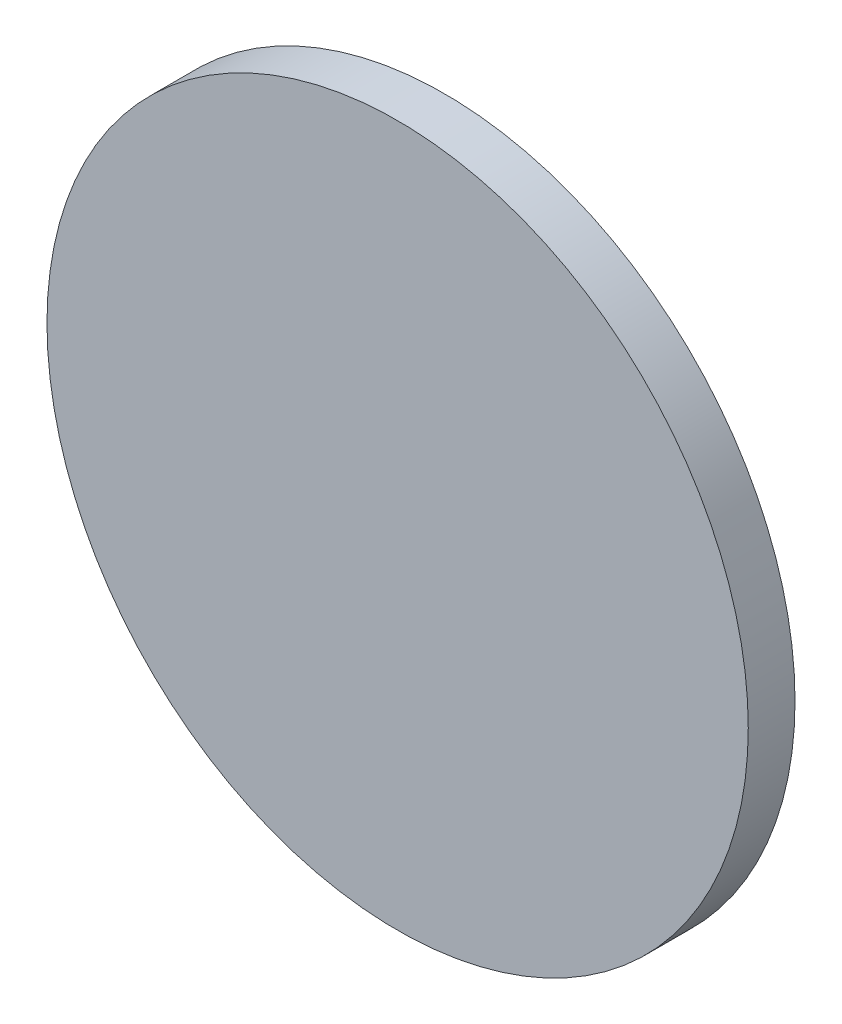
ISO-10303-21;
HEADER;
FILE_DESCRIPTION(('STEP AP214'),'2;1');
FILE_NAME('part.step','',(''),(''),'','','');
FILE_SCHEMA(('AUTOMOTIVE_DESIGN { 1 0 10303 214 1 1 1 1 }'));
ENDSEC;
DATA;
#1=APPLICATION_CONTEXT('core data for automotive mechanical design processes');
#2=APPLICATION_PROTOCOL_DEFINITION('international standard','automotive_design',2000,#1);
#3=PRODUCT_CONTEXT('',#1,'mechanical');
#4=PRODUCT('Part','Part','',(#3));
#5=PRODUCT_RELATED_PRODUCT_CATEGORY('part','',(#4));
#6=PRODUCT_DEFINITION_FORMATION('','',#4);
#7=PRODUCT_DEFINITION_CONTEXT('part definition',#1,'design');
#8=PRODUCT_DEFINITION('design','',#6,#7);
#9=PRODUCT_DEFINITION_SHAPE('','',#8);
#10=(LENGTH_UNIT() NAMED_UNIT(*) SI_UNIT(.MILLI.,.METRE.));
#11=(NAMED_UNIT(*) PLANE_ANGLE_UNIT() SI_UNIT($,.RADIAN.));
#12=(NAMED_UNIT(*) SI_UNIT($,.STERADIAN.) SOLID_ANGLE_UNIT());
#13=UNCERTAINTY_MEASURE_WITH_UNIT(LENGTH_MEASURE(1.E-05),#10,'distance_accuracy_value','');
#14=(GEOMETRIC_REPRESENTATION_CONTEXT(3) GLOBAL_UNCERTAINTY_ASSIGNED_CONTEXT((#13)) GLOBAL_UNIT_ASSIGNED_CONTEXT((#10,
#11,#12)) REPRESENTATION_CONTEXT('',''));
#15=CARTESIAN_POINT('',(0.,0.,0.));
#16=DIRECTION('',(0.,0.,1.));
#17=DIRECTION('',(1.,0.,0.));
#18=AXIS2_PLACEMENT_3D('',#15,#16,#17);
#19=CARTESIAN_POINT('',(18.7,-17.2,3.5));
#20=DIRECTION('',(0.,0.,-1.));
#21=DIRECTION('',(-1.,0.,0.));
#22=AXIS2_PLACEMENT_3D('',#19,#20,#21);
#23=PLANE('',#22);
#24=CARTESIAN_POINT('',(18.7,-17.2,3.5));
#25=DIRECTION('',(0.,0.,-1.));
#26=DIRECTION('',(-1.,0.,0.));
#27=AXIS2_PLACEMENT_3D('',#24,#25,#26);
#28=CIRCLE('',#27,1.5);
#29=CARTESIAN_POINT('',(17.2,-17.2,3.5));
#30=VERTEX_POINT('',#29);
#31=EDGE_CURVE('E18',#30,#30,#28,.F.);
#32=ORIENTED_EDGE('',*,*,#31,.F.);
#33=EDGE_LOOP('',(#32));
#34=FACE_BOUND('',#33,.T.);
#35=ADVANCED_FACE('F15',(#34),#23,.T.);
#36=CARTESIAN_POINT('',(18.7,-17.2,3.7));
#37=DIRECTION('',(0.,0.,-1.));
#38=DIRECTION('',(-1.,0.,0.));
#39=AXIS2_PLACEMENT_3D('',#36,#37,#38);
#40=CYLINDRICAL_SURFACE('',#39,1.5);
#41=CARTESIAN_POINT('',(18.7,-17.2,3.7));
#42=DIRECTION('',(0.,0.,-1.));
#43=DIRECTION('',(-1.,0.,0.));
#44=AXIS2_PLACEMENT_3D('',#41,#42,#43);
#45=CIRCLE('',#44,1.5);
#46=CARTESIAN_POINT('',(17.2,-17.2,3.7));
#47=VERTEX_POINT('',#46);
#48=EDGE_CURVE('E10',#47,#47,#45,.T.);
#49=ORIENTED_EDGE('',*,*,#48,.T.);
#50=EDGE_LOOP('',(#49));
#51=FACE_BOUND('',#50,.T.);
#52=ORIENTED_EDGE('',*,*,#31,.T.);
#53=EDGE_LOOP('',(#52));
#54=FACE_BOUND('',#53,.T.);
#55=ADVANCED_FACE('F27',(#51,#54),#40,.T.);
#56=CARTESIAN_POINT('',(18.7,-17.2,3.7));
#57=DIRECTION('',(0.,0.,-1.));
#58=DIRECTION('',(-1.,0.,0.));
#59=AXIS2_PLACEMENT_3D('',#56,#57,#58);
#60=PLANE('',#59);
#61=ORIENTED_EDGE('',*,*,#48,.F.);
#62=EDGE_LOOP('',(#61));
#63=FACE_BOUND('',#62,.T.);
#64=ADVANCED_FACE('F34',(#63),#60,.F.);
#65=CLOSED_SHELL('',(#35,#55,#64));
#66=MANIFOLD_SOLID_BREP('B1',#65);
#67=ADVANCED_BREP_SHAPE_REPRESENTATION('',(#18,#66),#14);
#68=SHAPE_DEFINITION_REPRESENTATION(#9,#67);
ENDSEC;
END-ISO-10303-21;
